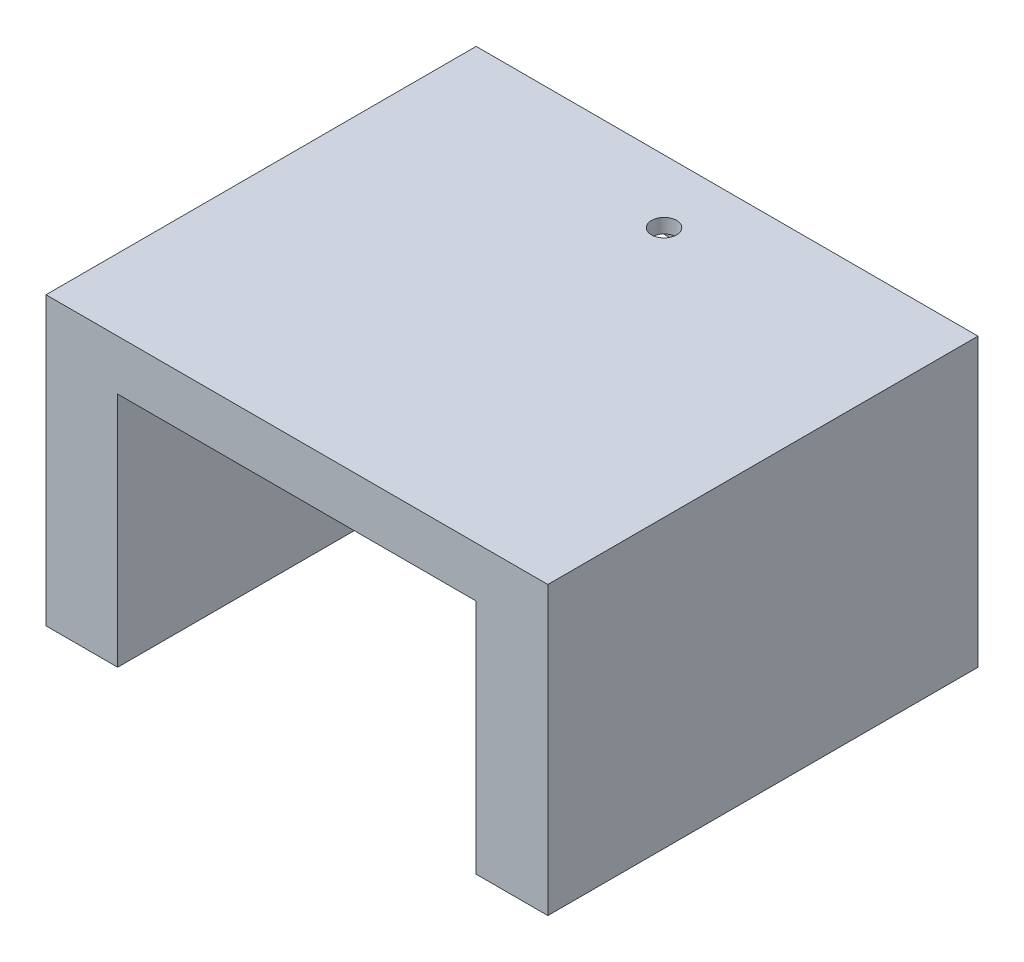
ISO-10303-21;
HEADER;
FILE_DESCRIPTION(('STEP AP214'),'2;1');
FILE_NAME('part.step','',(''),(''),'','','');
FILE_SCHEMA(('AUTOMOTIVE_DESIGN { 1 0 10303 214 1 1 1 1 }'));
ENDSEC;
DATA;
#1=APPLICATION_CONTEXT('core data for automotive mechanical design processes');
#2=APPLICATION_PROTOCOL_DEFINITION('international standard','automotive_design',2000,#1);
#3=PRODUCT_CONTEXT('',#1,'mechanical');
#4=PRODUCT('Part','Part','',(#3));
#5=PRODUCT_RELATED_PRODUCT_CATEGORY('part','',(#4));
#6=PRODUCT_DEFINITION_FORMATION('','',#4);
#7=PRODUCT_DEFINITION_CONTEXT('part definition',#1,'design');
#8=PRODUCT_DEFINITION('design','',#6,#7);
#9=PRODUCT_DEFINITION_SHAPE('','',#8);
#10=(LENGTH_UNIT() NAMED_UNIT(*) SI_UNIT(.MILLI.,.METRE.));
#11=(NAMED_UNIT(*) PLANE_ANGLE_UNIT() SI_UNIT($,.RADIAN.));
#12=(NAMED_UNIT(*) SI_UNIT($,.STERADIAN.) SOLID_ANGLE_UNIT());
#13=UNCERTAINTY_MEASURE_WITH_UNIT(LENGTH_MEASURE(1.E-05),#10,'distance_accuracy_value','');
#14=(GEOMETRIC_REPRESENTATION_CONTEXT(3) GLOBAL_UNCERTAINTY_ASSIGNED_CONTEXT((#13)) GLOBAL_UNIT_ASSIGNED_CONTEXT((#10,
#11,#12)) REPRESENTATION_CONTEXT('',''));
#15=CARTESIAN_POINT('',(0.,0.,0.));
#16=DIRECTION('',(0.,0.,1.));
#17=DIRECTION('',(1.,0.,0.));
#18=AXIS2_PLACEMENT_3D('',#15,#16,#17);
#19=CARTESIAN_POINT('',(10.8871315838892,-8.32284234752592,60.));
#20=DIRECTION('',(0.,-1.,0.));
#21=DIRECTION('',(0.,0.,-1.));
#22=AXIS2_PLACEMENT_3D('',#19,#20,#21);
#23=PLANE('',#22);
#24=CARTESIAN_POINT('',(-24.1128684161108,-8.32284234752592,8.79280196039261));
#25=DIRECTION('',(0.,1.,0.));
#26=DIRECTION('',(0.,0.,1.));
#27=AXIS2_PLACEMENT_3D('',#24,#25,#26);
#28=CIRCLE('',#27,1.75);
#29=CARTESIAN_POINT('',(-24.1128684161108,-8.32284234752592,10.5428019603926));
#30=VERTEX_POINT('',#29);
#31=EDGE_CURVE('E148',#30,#30,#28,.T.);
#32=ORIENTED_EDGE('',*,*,#31,.F.);
#33=EDGE_LOOP('',(#32));
#34=FACE_BOUND('',#33,.T.);
#35=DIRECTION('',(-1.,0.,0.));
#36=VECTOR('',#35,1.);
#37=CARTESIAN_POINT('',(10.8871315838892,-8.32284234752592,0.));
#38=LINE('',#37,#36);
#39=CARTESIAN_POINT('',(10.8871315838892,-8.32284234752592,0.));
#40=VERTEX_POINT('',#39);
#41=CARTESIAN_POINT('',(-59.1128684161108,-8.32284234752592,0.));
#42=VERTEX_POINT('',#41);
#43=EDGE_CURVE('E144',#40,#42,#38,.T.);
#44=ORIENTED_EDGE('',*,*,#43,.T.);
#45=DIRECTION('',(0.,0.,-1.));
#46=VECTOR('',#45,1.);
#47=CARTESIAN_POINT('',(-59.1128684161108,-8.32284234752592,60.));
#48=LINE('',#47,#46);
#49=CARTESIAN_POINT('',(-59.1128684161108,-8.32284234752592,60.));
#50=VERTEX_POINT('',#49);
#51=EDGE_CURVE('E11',#50,#42,#48,.T.);
#52=ORIENTED_EDGE('',*,*,#51,.F.);
#53=DIRECTION('',(-1.,0.,0.));
#54=VECTOR('',#53,1.);
#55=CARTESIAN_POINT('',(10.8871315838892,-8.32284234752592,60.));
#56=LINE('',#55,#54);
#57=CARTESIAN_POINT('',(10.8871315838892,-8.32284234752592,60.));
#58=VERTEX_POINT('',#57);
#59=EDGE_CURVE('E160',#58,#50,#56,.T.);
#60=ORIENTED_EDGE('',*,*,#59,.F.);
#61=DIRECTION('',(0.,0.,-1.));
#62=VECTOR('',#61,1.);
#63=CARTESIAN_POINT('',(10.8871315838892,-8.32284234752592,60.));
#64=LINE('',#63,#62);
#65=EDGE_CURVE('E140',#58,#40,#64,.T.);
#66=ORIENTED_EDGE('',*,*,#65,.T.);
#67=EDGE_LOOP('',(#44,#52,#60,#66));
#68=FACE_BOUND('',#67,.T.);
#69=ADVANCED_FACE('F35',(#34,#68),#23,.F.);
#70=CARTESIAN_POINT('',(-59.1128684161108,-8.32284234752592,60.));
#71=DIRECTION('',(1.,0.,0.));
#72=DIRECTION('',(0.,1.,0.));
#73=AXIS2_PLACEMENT_3D('',#70,#71,#72);
#74=PLANE('',#73);
#75=DIRECTION('',(0.,-1.,0.));
#76=VECTOR('',#75,1.);
#77=CARTESIAN_POINT('',(-59.1128684161108,-8.32284234752592,0.));
#78=LINE('',#77,#76);
#79=CARTESIAN_POINT('',(-59.1128684161108,-48.3228423475259,0.));
#80=VERTEX_POINT('',#79);
#81=EDGE_CURVE('E147',#42,#80,#78,.T.);
#82=ORIENTED_EDGE('',*,*,#81,.T.);
#83=DIRECTION('',(0.,0.,-1.));
#84=VECTOR('',#83,1.);
#85=CARTESIAN_POINT('',(-59.1128684161108,-48.3228423475259,60.));
#86=LINE('',#85,#84);
#87=CARTESIAN_POINT('',(-59.1128684161108,-48.3228423475259,60.));
#88=VERTEX_POINT('',#87);
#89=EDGE_CURVE('E43',#88,#80,#86,.T.);
#90=ORIENTED_EDGE('',*,*,#89,.F.);
#91=DIRECTION('',(0.,-1.,0.));
#92=VECTOR('',#91,1.);
#93=CARTESIAN_POINT('',(-59.1128684161108,-8.32284234752592,60.));
#94=LINE('',#93,#92);
#95=EDGE_CURVE('E100',#50,#88,#94,.T.);
#96=ORIENTED_EDGE('',*,*,#95,.F.);
#97=ORIENTED_EDGE('',*,*,#51,.T.);
#98=EDGE_LOOP('',(#82,#90,#96,#97));
#99=FACE_BOUND('',#98,.T.);
#100=ADVANCED_FACE('F266',(#99),#74,.F.);
#101=CARTESIAN_POINT('',(-49.1128684161108,-48.3228423475259,60.));
#102=DIRECTION('',(0.,1.,0.));
#103=DIRECTION('',(0.,0.,1.));
#104=AXIS2_PLACEMENT_3D('',#101,#102,#103);
#105=PLANE('',#104);
#106=DIRECTION('',(1.,0.,0.));
#107=VECTOR('',#106,1.);
#108=CARTESIAN_POINT('',(-49.1128684161108,-48.3228423475259,0.));
#109=LINE('',#108,#107);
#110=CARTESIAN_POINT('',(-49.1128684161108,-48.3228423475259,0.));
#111=VERTEX_POINT('',#110);
#112=EDGE_CURVE('E150',#80,#111,#109,.T.);
#113=ORIENTED_EDGE('',*,*,#112,.T.);
#114=DIRECTION('',(0.,0.,-1.));
#115=VECTOR('',#114,1.);
#116=CARTESIAN_POINT('',(-49.1128684161108,-48.3228423475259,60.));
#117=LINE('',#116,#115);
#118=CARTESIAN_POINT('',(-49.1128684161108,-48.3228423475259,60.));
#119=VERTEX_POINT('',#118);
#120=EDGE_CURVE('E167',#119,#111,#117,.T.);
#121=ORIENTED_EDGE('',*,*,#120,.F.);
#122=DIRECTION('',(1.,0.,0.));
#123=VECTOR('',#122,1.);
#124=CARTESIAN_POINT('',(-49.1128684161108,-48.3228423475259,60.));
#125=LINE('',#124,#123);
#126=EDGE_CURVE('E176',#88,#119,#125,.T.);
#127=ORIENTED_EDGE('',*,*,#126,.F.);
#128=ORIENTED_EDGE('',*,*,#89,.T.);
#129=EDGE_LOOP('',(#113,#121,#127,#128));
#130=FACE_BOUND('',#129,.T.);
#131=ADVANCED_FACE('F174',(#130),#105,.F.);
#132=CARTESIAN_POINT('',(-49.1128684161108,-15.3228423475259,60.));
#133=DIRECTION('',(-1.,0.,0.));
#134=DIRECTION('',(0.,-1.,0.));
#135=AXIS2_PLACEMENT_3D('',#132,#133,#134);
#136=PLANE('',#135);
#137=DIRECTION('',(0.,1.,0.));
#138=VECTOR('',#137,1.);
#139=CARTESIAN_POINT('',(-49.1128684161108,-15.3228423475259,0.));
#140=LINE('',#139,#138);
#141=CARTESIAN_POINT('',(-49.1128684161108,-15.3228423475259,0.));
#142=VERTEX_POINT('',#141);
#143=EDGE_CURVE('E152',#111,#142,#140,.T.);
#144=ORIENTED_EDGE('',*,*,#143,.T.);
#145=DIRECTION('',(0.,0.,-1.));
#146=VECTOR('',#145,1.);
#147=CARTESIAN_POINT('',(-49.1128684161108,-15.3228423475259,60.));
#148=LINE('',#147,#146);
#149=CARTESIAN_POINT('',(-49.1128684161108,-15.3228423475259,60.));
#150=VERTEX_POINT('',#149);
#151=EDGE_CURVE('E164',#150,#142,#148,.T.);
#152=ORIENTED_EDGE('',*,*,#151,.F.);
#153=DIRECTION('',(0.,1.,0.));
#154=VECTOR('',#153,1.);
#155=CARTESIAN_POINT('',(-49.1128684161108,-15.3228423475259,60.));
#156=LINE('',#155,#154);
#157=EDGE_CURVE('E188',#119,#150,#156,.T.);
#158=ORIENTED_EDGE('',*,*,#157,.F.);
#159=ORIENTED_EDGE('',*,*,#120,.T.);
#160=EDGE_LOOP('',(#144,#152,#158,#159));
#161=FACE_BOUND('',#160,.T.);
#162=ADVANCED_FACE('F184',(#161),#136,.F.);
#163=CARTESIAN_POINT('',(-49.1128684161108,-15.3228423475259,60.));
#164=DIRECTION('',(0.,1.,0.));
#165=DIRECTION('',(0.,0.,1.));
#166=AXIS2_PLACEMENT_3D('',#163,#164,#165);
#167=PLANE('',#166);
#168=DIRECTION('',(1.,0.,0.));
#169=VECTOR('',#168,1.);
#170=CARTESIAN_POINT('',(-31.5025030786897,-15.3228423475259,2.59561227148507));
#171=LINE('',#170,#169);
#172=CARTESIAN_POINT('',(-31.5025030786897,-15.3228423475259,2.59561227148507));
#173=VERTEX_POINT('',#172);
#174=CARTESIAN_POINT('',(-16.7232337535319,-15.3228423475259,2.59561227148507));
#175=VERTEX_POINT('',#174);
#176=EDGE_CURVE('E214',#173,#175,#171,.T.);
#177=ORIENTED_EDGE('',*,*,#176,.F.);
#178=DIRECTION('',(0.,0.,-1.));
#179=VECTOR('',#178,1.);
#180=CARTESIAN_POINT('',(-31.5025030786897,-15.3228423475259,2.59561227148507));
#181=LINE('',#180,#179);
#182=CARTESIAN_POINT('',(-31.5025030786897,-15.3228423475259,14.9899916493001));
#183=VERTEX_POINT('',#182);
#184=EDGE_CURVE('E50',#183,#173,#181,.T.);
#185=ORIENTED_EDGE('',*,*,#184,.F.);
#186=DIRECTION('',(-1.,0.,0.));
#187=VECTOR('',#186,1.);
#188=CARTESIAN_POINT('',(-31.5025030786897,-15.3228423475259,14.9899916493001));
#189=LINE('',#188,#187);
#190=CARTESIAN_POINT('',(-16.7232337535319,-15.3228423475259,14.9899916493001));
#191=VERTEX_POINT('',#190);
#192=EDGE_CURVE('E207',#191,#183,#189,.T.);
#193=ORIENTED_EDGE('',*,*,#192,.F.);
#194=DIRECTION('',(0.,0.,1.));
#195=VECTOR('',#194,1.);
#196=CARTESIAN_POINT('',(-16.7232337535319,-15.3228423475259,2.59561227148507));
#197=LINE('',#196,#195);
#198=EDGE_CURVE('E211',#175,#191,#197,.T.);
#199=ORIENTED_EDGE('',*,*,#198,.F.);
#200=EDGE_LOOP('',(#177,#185,#193,#199));
#201=FACE_BOUND('',#200,.T.);
#202=DIRECTION('',(1.,0.,0.));
#203=VECTOR('',#202,1.);
#204=CARTESIAN_POINT('',(-49.1128684161108,-15.3228423475259,0.));
#205=LINE('',#204,#203);
#206=CARTESIAN_POINT('',(0.887131583889228,-15.3228423475259,0.));
#207=VERTEX_POINT('',#206);
#208=EDGE_CURVE('E154',#142,#207,#205,.T.);
#209=ORIENTED_EDGE('',*,*,#208,.T.);
#210=DIRECTION('',(0.,0.,-1.));
#211=VECTOR('',#210,1.);
#212=CARTESIAN_POINT('',(0.887131583889228,-15.3228423475259,60.));
#213=LINE('',#212,#211);
#214=CARTESIAN_POINT('',(0.887131583889228,-15.3228423475259,60.));
#215=VERTEX_POINT('',#214);
#216=EDGE_CURVE('E135',#215,#207,#213,.T.);
#217=ORIENTED_EDGE('',*,*,#216,.F.);
#218=DIRECTION('',(1.,0.,0.));
#219=VECTOR('',#218,1.);
#220=CARTESIAN_POINT('',(-49.1128684161108,-15.3228423475259,60.));
#221=LINE('',#220,#219);
#222=EDGE_CURVE('E123',#150,#215,#221,.T.);
#223=ORIENTED_EDGE('',*,*,#222,.F.);
#224=ORIENTED_EDGE('',*,*,#151,.T.);
#225=EDGE_LOOP('',(#209,#217,#223,#224));
#226=FACE_BOUND('',#225,.T.);
#227=ADVANCED_FACE('F187',(#201,#226),#167,.F.);
#228=CARTESIAN_POINT('',(0.887131583889228,-15.3228423475259,60.));
#229=DIRECTION('',(1.,0.,0.));
#230=DIRECTION('',(0.,1.,0.));
#231=AXIS2_PLACEMENT_3D('',#228,#229,#230);
#232=PLANE('',#231);
#233=DIRECTION('',(0.,-1.,0.));
#234=VECTOR('',#233,1.);
#235=CARTESIAN_POINT('',(0.887131583889228,-15.3228423475259,0.));
#236=LINE('',#235,#234);
#237=CARTESIAN_POINT('',(0.887131583889235,-48.3228423475259,0.));
#238=VERTEX_POINT('',#237);
#239=EDGE_CURVE('E132',#207,#238,#236,.T.);
#240=ORIENTED_EDGE('',*,*,#239,.T.);
#241=DIRECTION('',(0.,0.,-1.));
#242=VECTOR('',#241,1.);
#243=CARTESIAN_POINT('',(0.887131583889235,-48.3228423475259,60.));
#244=LINE('',#243,#242);
#245=CARTESIAN_POINT('',(0.887131583889235,-48.3228423475259,60.));
#246=VERTEX_POINT('',#245);
#247=EDGE_CURVE('E129',#246,#238,#244,.T.);
#248=ORIENTED_EDGE('',*,*,#247,.F.);
#249=DIRECTION('',(0.,-1.,0.));
#250=VECTOR('',#249,1.);
#251=CARTESIAN_POINT('',(0.887131583889228,-15.3228423475259,60.));
#252=LINE('',#251,#250);
#253=EDGE_CURVE('E116',#215,#246,#252,.T.);
#254=ORIENTED_EDGE('',*,*,#253,.F.);
#255=ORIENTED_EDGE('',*,*,#216,.T.);
#256=EDGE_LOOP('',(#240,#248,#254,#255));
#257=FACE_BOUND('',#256,.T.);
#258=ADVANCED_FACE('F130',(#257),#232,.F.);
#259=CARTESIAN_POINT('',(0.887131583889235,-48.3228423475259,60.));
#260=DIRECTION('',(0.,1.,0.));
#261=DIRECTION('',(0.,0.,1.));
#262=AXIS2_PLACEMENT_3D('',#259,#260,#261);
#263=PLANE('',#262);
#264=DIRECTION('',(1.,0.,0.));
#265=VECTOR('',#264,1.);
#266=CARTESIAN_POINT('',(0.887131583889235,-48.3228423475259,0.));
#267=LINE('',#266,#265);
#268=CARTESIAN_POINT('',(10.8871315838892,-48.3228423475259,0.));
#269=VERTEX_POINT('',#268);
#270=EDGE_CURVE('E157',#238,#269,#267,.T.);
#271=ORIENTED_EDGE('',*,*,#270,.T.);
#272=DIRECTION('',(0.,0.,-1.));
#273=VECTOR('',#272,1.);
#274=CARTESIAN_POINT('',(10.8871315838892,-48.3228423475259,60.));
#275=LINE('',#274,#273);
#276=CARTESIAN_POINT('',(10.8871315838892,-48.3228423475259,60.));
#277=VERTEX_POINT('',#276);
#278=EDGE_CURVE('E136',#277,#269,#275,.T.);
#279=ORIENTED_EDGE('',*,*,#278,.F.);
#280=DIRECTION('',(1.,0.,0.));
#281=VECTOR('',#280,1.);
#282=CARTESIAN_POINT('',(0.887131583889235,-48.3228423475259,60.));
#283=LINE('',#282,#281);
#284=EDGE_CURVE('E120',#246,#277,#283,.T.);
#285=ORIENTED_EDGE('',*,*,#284,.F.);
#286=ORIENTED_EDGE('',*,*,#247,.T.);
#287=EDGE_LOOP('',(#271,#279,#285,#286));
#288=FACE_BOUND('',#287,.T.);
#289=ADVANCED_FACE('F138',(#288),#263,.F.);
#290=CARTESIAN_POINT('',(10.8871315838892,-8.32284234752592,60.));
#291=DIRECTION('',(-1.,0.,0.));
#292=DIRECTION('',(0.,-1.,0.));
#293=AXIS2_PLACEMENT_3D('',#290,#291,#292);
#294=PLANE('',#293);
#295=DIRECTION('',(0.,1.,0.));
#296=VECTOR('',#295,1.);
#297=CARTESIAN_POINT('',(10.8871315838892,-8.32284234752592,0.));
#298=LINE('',#297,#296);
#299=EDGE_CURVE('E92',#269,#40,#298,.T.);
#300=ORIENTED_EDGE('',*,*,#299,.T.);
#301=ORIENTED_EDGE('',*,*,#65,.F.);
#302=DIRECTION('',(0.,1.,0.));
#303=VECTOR('',#302,1.);
#304=CARTESIAN_POINT('',(10.8871315838892,-8.32284234752592,60.));
#305=LINE('',#304,#303);
#306=EDGE_CURVE('E59',#277,#58,#305,.T.);
#307=ORIENTED_EDGE('',*,*,#306,.F.);
#308=ORIENTED_EDGE('',*,*,#278,.T.);
#309=EDGE_LOOP('',(#300,#301,#307,#308));
#310=FACE_BOUND('',#309,.T.);
#311=ADVANCED_FACE('F275',(#310),#294,.F.);
#312=CARTESIAN_POINT('',(0.,0.,60.));
#313=DIRECTION('',(0.,0.,1.));
#314=DIRECTION('',(1.,0.,0.));
#315=AXIS2_PLACEMENT_3D('',#312,#313,#314);
#316=PLANE('',#315);
#317=ORIENTED_EDGE('',*,*,#59,.T.);
#318=ORIENTED_EDGE('',*,*,#95,.T.);
#319=ORIENTED_EDGE('',*,*,#126,.T.);
#320=ORIENTED_EDGE('',*,*,#157,.T.);
#321=ORIENTED_EDGE('',*,*,#222,.T.);
#322=ORIENTED_EDGE('',*,*,#253,.T.);
#323=ORIENTED_EDGE('',*,*,#284,.T.);
#324=ORIENTED_EDGE('',*,*,#306,.T.);
#325=EDGE_LOOP('',(#317,#318,#319,#320,#321,#322,#323,#324));
#326=FACE_BOUND('',#325,.T.);
#327=ADVANCED_FACE('F118',(#326),#316,.T.);
#328=CARTESIAN_POINT('',(0.,0.,0.));
#329=DIRECTION('',(0.,0.,1.));
#330=DIRECTION('',(1.,0.,0.));
#331=AXIS2_PLACEMENT_3D('',#328,#329,#330);
#332=PLANE('',#331);
#333=ORIENTED_EDGE('',*,*,#43,.F.);
#334=ORIENTED_EDGE('',*,*,#299,.F.);
#335=ORIENTED_EDGE('',*,*,#270,.F.);
#336=ORIENTED_EDGE('',*,*,#239,.F.);
#337=ORIENTED_EDGE('',*,*,#208,.F.);
#338=ORIENTED_EDGE('',*,*,#143,.F.);
#339=ORIENTED_EDGE('',*,*,#112,.F.);
#340=ORIENTED_EDGE('',*,*,#81,.F.);
#341=EDGE_LOOP('',(#333,#334,#335,#336,#337,#338,#339,#340));
#342=FACE_BOUND('',#341,.T.);
#343=ADVANCED_FACE('F180',(#342),#332,.F.);
#344=CARTESIAN_POINT('',(-24.1128684161108,-48.3228423475259,8.79280196039261));
#345=DIRECTION('',(0.,1.,0.));
#346=DIRECTION('',(0.,0.,1.));
#347=AXIS2_PLACEMENT_3D('',#344,#345,#346);
#348=CYLINDRICAL_SURFACE('',#347,1.75);
#349=CARTESIAN_POINT('',(-24.1128684161108,-10.3228423475259,8.79280196039261));
#350=DIRECTION('',(0.,1.,0.));
#351=DIRECTION('',(0.,0.,1.));
#352=AXIS2_PLACEMENT_3D('',#349,#350,#351);
#353=CIRCLE('',#352,1.75);
#354=CARTESIAN_POINT('',(-24.1128684161108,-10.3228423475259,10.5428019603926));
#355=VERTEX_POINT('',#354);
#356=EDGE_CURVE('E38',#355,#355,#353,.F.);
#357=ORIENTED_EDGE('',*,*,#356,.T.);
#358=EDGE_LOOP('',(#357));
#359=FACE_BOUND('',#358,.T.);
#360=ORIENTED_EDGE('',*,*,#31,.T.);
#361=EDGE_LOOP('',(#360));
#362=FACE_BOUND('',#361,.T.);
#363=ADVANCED_FACE('F332',(#359,#362),#348,.F.);
#364=CARTESIAN_POINT('',(0.,-10.3228423475259,0.));
#365=DIRECTION('',(0.,1.,0.));
#366=DIRECTION('',(0.,0.,1.));
#367=AXIS2_PLACEMENT_3D('',#364,#365,#366);
#368=PLANE('',#367);
#369=DIRECTION('',(0.,0.,-1.));
#370=VECTOR('',#369,1.);
#371=CARTESIAN_POINT('',(-31.5025030786897,-10.3228423475259,2.59561227148507));
#372=LINE('',#371,#370);
#373=CARTESIAN_POINT('',(-31.5025030786897,-10.3228423475259,14.9899916493001));
#374=VERTEX_POINT('',#373);
#375=CARTESIAN_POINT('',(-31.5025030786897,-10.3228423475259,2.59561227148507));
#376=VERTEX_POINT('',#375);
#377=EDGE_CURVE('E210',#374,#376,#372,.T.);
#378=ORIENTED_EDGE('',*,*,#377,.T.);
#379=DIRECTION('',(1.,0.,0.));
#380=VECTOR('',#379,1.);
#381=CARTESIAN_POINT('',(-31.5025030786897,-10.3228423475259,2.59561227148507));
#382=LINE('',#381,#380);
#383=CARTESIAN_POINT('',(-16.7232337535319,-10.3228423475259,2.59561227148507));
#384=VERTEX_POINT('',#383);
#385=EDGE_CURVE('E223',#376,#384,#382,.T.);
#386=ORIENTED_EDGE('',*,*,#385,.T.);
#387=DIRECTION('',(0.,0.,1.));
#388=VECTOR('',#387,1.);
#389=CARTESIAN_POINT('',(-16.7232337535319,-10.3228423475259,2.59561227148507));
#390=LINE('',#389,#388);
#391=CARTESIAN_POINT('',(-16.7232337535319,-10.3228423475259,14.9899916493001));
#392=VERTEX_POINT('',#391);
#393=EDGE_CURVE('E220',#384,#392,#390,.T.);
#394=ORIENTED_EDGE('',*,*,#393,.T.);
#395=DIRECTION('',(-1.,0.,0.));
#396=VECTOR('',#395,1.);
#397=CARTESIAN_POINT('',(-31.5025030786897,-10.3228423475259,14.9899916493001));
#398=LINE('',#397,#396);
#399=EDGE_CURVE('E199',#392,#374,#398,.T.);
#400=ORIENTED_EDGE('',*,*,#399,.T.);
#401=EDGE_LOOP('',(#378,#386,#394,#400));
#402=FACE_BOUND('',#401,.T.);
#403=ORIENTED_EDGE('',*,*,#356,.F.);
#404=EDGE_LOOP('',(#403));
#405=FACE_BOUND('',#404,.T.);
#406=ADVANCED_FACE('F230',(#402,#405),#368,.F.);
#407=CARTESIAN_POINT('',(-31.5025030786897,-10.3228423475259,2.59561227148507));
#408=DIRECTION('',(-1.,0.,0.));
#409=DIRECTION('',(0.,0.,1.));
#410=AXIS2_PLACEMENT_3D('',#407,#408,#409);
#411=PLANE('',#410);
#412=ORIENTED_EDGE('',*,*,#184,.T.);
#413=DIRECTION('',(0.,-1.,0.));
#414=VECTOR('',#413,1.);
#415=CARTESIAN_POINT('',(-31.5025030786897,-10.3228423475259,2.59561227148507));
#416=LINE('',#415,#414);
#417=EDGE_CURVE('E196',#376,#173,#416,.T.);
#418=ORIENTED_EDGE('',*,*,#417,.F.);
#419=ORIENTED_EDGE('',*,*,#377,.F.);
#420=DIRECTION('',(0.,-1.,0.));
#421=VECTOR('',#420,1.);
#422=CARTESIAN_POINT('',(-31.5025030786897,-10.3228423475259,14.9899916493001));
#423=LINE('',#422,#421);
#424=EDGE_CURVE('E205',#374,#183,#423,.T.);
#425=ORIENTED_EDGE('',*,*,#424,.T.);
#426=EDGE_LOOP('',(#412,#418,#419,#425));
#427=FACE_BOUND('',#426,.T.);
#428=ADVANCED_FACE('F236',(#427),#411,.F.);
#429=CARTESIAN_POINT('',(-31.5025030786897,-10.3228423475259,14.9899916493001));
#430=DIRECTION('',(0.,0.,1.));
#431=DIRECTION('',(1.,0.,0.));
#432=AXIS2_PLACEMENT_3D('',#429,#430,#431);
#433=PLANE('',#432);
#434=ORIENTED_EDGE('',*,*,#192,.T.);
#435=ORIENTED_EDGE('',*,*,#424,.F.);
#436=ORIENTED_EDGE('',*,*,#399,.F.);
#437=DIRECTION('',(0.,-1.,0.));
#438=VECTOR('',#437,1.);
#439=CARTESIAN_POINT('',(-16.7232337535319,-10.3228423475259,14.9899916493001));
#440=LINE('',#439,#438);
#441=EDGE_CURVE('E202',#392,#191,#440,.T.);
#442=ORIENTED_EDGE('',*,*,#441,.T.);
#443=EDGE_LOOP('',(#434,#435,#436,#442));
#444=FACE_BOUND('',#443,.T.);
#445=ADVANCED_FACE('F247',(#444),#433,.F.);
#446=CARTESIAN_POINT('',(-16.7232337535319,-10.3228423475259,2.59561227148507));
#447=DIRECTION('',(1.,0.,0.));
#448=DIRECTION('',(0.,0.,-1.));
#449=AXIS2_PLACEMENT_3D('',#446,#447,#448);
#450=PLANE('',#449);
#451=ORIENTED_EDGE('',*,*,#198,.T.);
#452=ORIENTED_EDGE('',*,*,#441,.F.);
#453=ORIENTED_EDGE('',*,*,#393,.F.);
#454=DIRECTION('',(0.,-1.,0.));
#455=VECTOR('',#454,1.);
#456=CARTESIAN_POINT('',(-16.7232337535319,-10.3228423475259,2.59561227148507));
#457=LINE('',#456,#455);
#458=EDGE_CURVE('E198',#384,#175,#457,.T.);
#459=ORIENTED_EDGE('',*,*,#458,.T.);
#460=EDGE_LOOP('',(#451,#452,#453,#459));
#461=FACE_BOUND('',#460,.T.);
#462=ADVANCED_FACE('F252',(#461),#450,.F.);
#463=CARTESIAN_POINT('',(-31.5025030786897,-10.3228423475259,2.59561227148507));
#464=DIRECTION('',(0.,0.,-1.));
#465=DIRECTION('',(-1.,0.,0.));
#466=AXIS2_PLACEMENT_3D('',#463,#464,#465);
#467=PLANE('',#466);
#468=ORIENTED_EDGE('',*,*,#176,.T.);
#469=ORIENTED_EDGE('',*,*,#458,.F.);
#470=ORIENTED_EDGE('',*,*,#385,.F.);
#471=ORIENTED_EDGE('',*,*,#417,.T.);
#472=EDGE_LOOP('',(#468,#469,#470,#471));
#473=FACE_BOUND('',#472,.T.);
#474=ADVANCED_FACE('F257',(#473),#467,.F.);
#475=CLOSED_SHELL('',(#69,#100,#131,#162,#227,#258,#289,#311,#327,#343,#363,#406,#428,#445,#462,#474));
#476=MANIFOLD_SOLID_BREP('B2',#475);
#477=ADVANCED_BREP_SHAPE_REPRESENTATION('',(#18,#476),#14);
#478=SHAPE_DEFINITION_REPRESENTATION(#9,#477);
ENDSEC;
END-ISO-10303-21;
